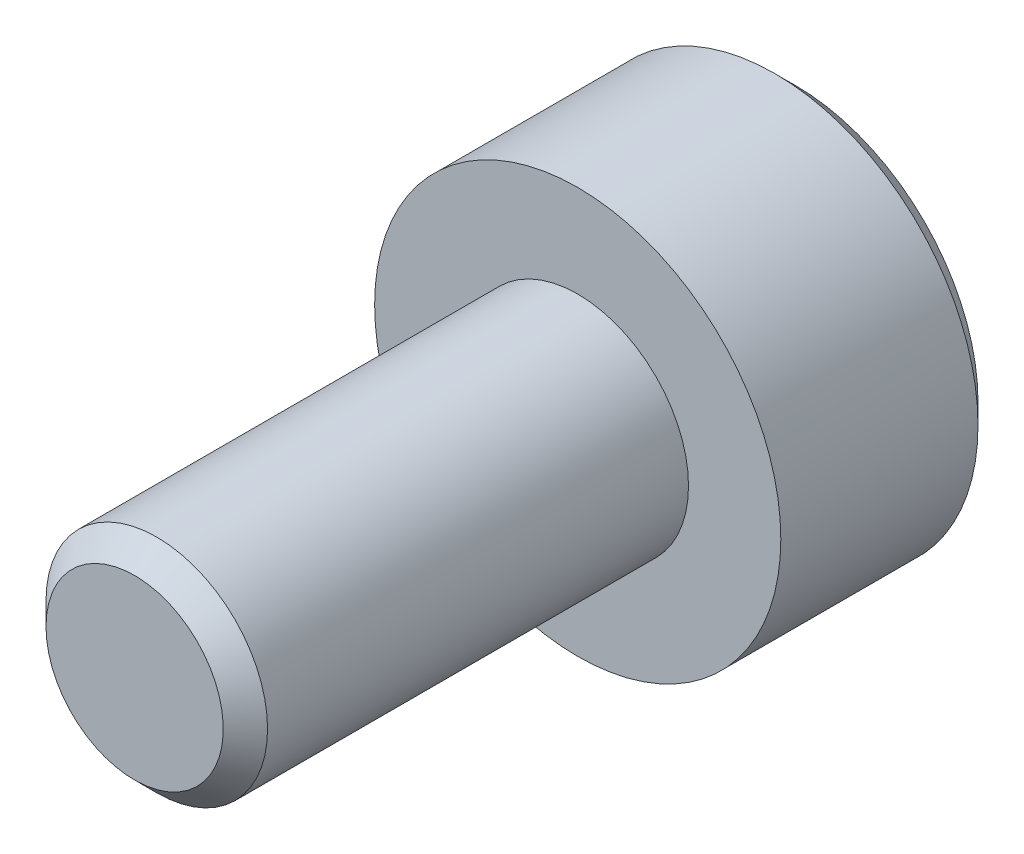
ISO-10303-21;
HEADER;
FILE_DESCRIPTION(('STEP AP214'),'2;1');
FILE_NAME('part.step','',(''),(''),'','','');
FILE_SCHEMA(('AUTOMOTIVE_DESIGN { 1 0 10303 214 1 1 1 1 }'));
ENDSEC;
DATA;
#1=APPLICATION_CONTEXT('core data for automotive mechanical design processes');
#2=APPLICATION_PROTOCOL_DEFINITION('international standard','automotive_design',2000,#1);
#3=PRODUCT_CONTEXT('',#1,'mechanical');
#4=PRODUCT('Part','Part','',(#3));
#5=PRODUCT_RELATED_PRODUCT_CATEGORY('part','',(#4));
#6=PRODUCT_DEFINITION_FORMATION('','',#4);
#7=PRODUCT_DEFINITION_CONTEXT('part definition',#1,'design');
#8=PRODUCT_DEFINITION('design','',#6,#7);
#9=PRODUCT_DEFINITION_SHAPE('','',#8);
#10=(LENGTH_UNIT() NAMED_UNIT(*) SI_UNIT(.MILLI.,.METRE.));
#11=(NAMED_UNIT(*) PLANE_ANGLE_UNIT() SI_UNIT($,.RADIAN.));
#12=(NAMED_UNIT(*) SI_UNIT($,.STERADIAN.) SOLID_ANGLE_UNIT());
#13=UNCERTAINTY_MEASURE_WITH_UNIT(LENGTH_MEASURE(1.E-05),#10,'distance_accuracy_value','');
#14=(GEOMETRIC_REPRESENTATION_CONTEXT(3) GLOBAL_UNCERTAINTY_ASSIGNED_CONTEXT((#13)) GLOBAL_UNIT_ASSIGNED_CONTEXT((#10,
#11,#12)) REPRESENTATION_CONTEXT('',''));
#15=CARTESIAN_POINT('',(0.,0.,0.));
#16=DIRECTION('',(0.,0.,1.));
#17=DIRECTION('',(1.,0.,0.));
#18=AXIS2_PLACEMENT_3D('',#15,#16,#17);
#19=CARTESIAN_POINT('',(0.,0.,-1.445));
#20=DIRECTION('',(0.,0.,1.));
#21=DIRECTION('',(1.,0.,0.));
#22=AXIS2_PLACEMENT_3D('',#19,#20,#21);
#23=PLANE('',#22);
#24=DIRECTION('',(-0.866025403784439,-0.5,0.));
#25=VECTOR('',#24,1.);
#26=CARTESIAN_POINT('',(-1.25,0.721687836487032,-1.445));
#27=LINE('',#26,#25);
#28=CARTESIAN_POINT('',(-1.25,0.721687836487032,-1.445));
#29=VERTEX_POINT('',#28);
#30=CARTESIAN_POINT('',(0.,1.44337567297406,-1.445));
#31=VERTEX_POINT('',#30);
#32=EDGE_CURVE('E68',#29,#31,#27,.F.);
#33=ORIENTED_EDGE('',*,*,#32,.T.);
#34=DIRECTION('',(-0.866025403784439,0.5,0.));
#35=VECTOR('',#34,1.);
#36=CARTESIAN_POINT('',(0.,1.44337567297406,-1.445));
#37=LINE('',#36,#35);
#38=CARTESIAN_POINT('',(1.25,0.721687836487031,-1.445));
#39=VERTEX_POINT('',#38);
#40=EDGE_CURVE('E98',#31,#39,#37,.F.);
#41=ORIENTED_EDGE('',*,*,#40,.T.);
#42=DIRECTION('',(0.,1.,0.));
#43=VECTOR('',#42,1.);
#44=CARTESIAN_POINT('',(1.25,0.721687836487032,-1.445));
#45=LINE('',#44,#43);
#46=CARTESIAN_POINT('',(1.25,-0.721687836487032,-1.445));
#47=VERTEX_POINT('',#46);
#48=EDGE_CURVE('E150',#39,#47,#45,.F.);
#49=ORIENTED_EDGE('',*,*,#48,.T.);
#50=DIRECTION('',(0.866025403784439,0.499999999999999,0.));
#51=VECTOR('',#50,1.);
#52=CARTESIAN_POINT('',(1.25,-0.721687836487032,-1.445));
#53=LINE('',#52,#51);
#54=CARTESIAN_POINT('',(0.,-1.44337567297406,-1.445));
#55=VERTEX_POINT('',#54);
#56=EDGE_CURVE('E143',#47,#55,#53,.F.);
#57=ORIENTED_EDGE('',*,*,#56,.T.);
#58=DIRECTION('',(0.866025403784438,-0.5,0.));
#59=VECTOR('',#58,1.);
#60=CARTESIAN_POINT('',(0.,-1.44337567297406,-1.445));
#61=LINE('',#60,#59);
#62=CARTESIAN_POINT('',(-1.25,-0.721687836487031,-1.445));
#63=VERTEX_POINT('',#62);
#64=EDGE_CURVE('E74',#55,#63,#61,.F.);
#65=ORIENTED_EDGE('',*,*,#64,.T.);
#66=DIRECTION('',(0.,1.,0.));
#67=VECTOR('',#66,1.);
#68=CARTESIAN_POINT('',(-1.25,-0.721687836487032,-1.445));
#69=LINE('',#68,#67);
#70=EDGE_CURVE('E71',#63,#29,#69,.T.);
#71=ORIENTED_EDGE('',*,*,#70,.T.);
#72=EDGE_LOOP('',(#33,#41,#49,#57,#65,#71));
#73=FACE_BOUND('',#72,.T.);
#74=ADVANCED_FACE('F16',(#73),#23,.F.);
#75=CARTESIAN_POINT('',(-1.25,-0.721687836487032,-2.945));
#76=DIRECTION('',(-1.,0.,0.));
#77=DIRECTION('',(0.,0.,1.));
#78=AXIS2_PLACEMENT_3D('',#75,#76,#77);
#79=PLANE('',#78);
#80=ORIENTED_EDGE('',*,*,#70,.F.);
#81=DIRECTION('',(0.,0.,1.));
#82=VECTOR('',#81,1.);
#83=CARTESIAN_POINT('',(-1.25,-0.721687836487029,-2.945));
#84=LINE('',#83,#82);
#85=CARTESIAN_POINT('',(-1.25,-0.721687836487031,-2.945));
#86=VERTEX_POINT('',#85);
#87=EDGE_CURVE('E136',#63,#86,#84,.F.);
#88=ORIENTED_EDGE('',*,*,#87,.T.);
#89=DIRECTION('',(0.,1.,0.));
#90=VECTOR('',#89,1.);
#91=CARTESIAN_POINT('',(-1.25,0.,-2.945));
#92=LINE('',#91,#90);
#93=CARTESIAN_POINT('',(-1.25,0.721687836487032,-2.945));
#94=VERTEX_POINT('',#93);
#95=EDGE_CURVE('E83',#86,#94,#92,.T.);
#96=ORIENTED_EDGE('',*,*,#95,.T.);
#97=DIRECTION('',(0.,0.,1.));
#98=VECTOR('',#97,1.);
#99=CARTESIAN_POINT('',(-1.25,0.721687836487032,-2.945));
#100=LINE('',#99,#98);
#101=EDGE_CURVE('E78',#94,#29,#100,.T.);
#102=ORIENTED_EDGE('',*,*,#101,.T.);
#103=EDGE_LOOP('',(#80,#88,#96,#102));
#104=FACE_BOUND('',#103,.T.);
#105=ADVANCED_FACE('F81',(#104),#79,.F.);
#106=CARTESIAN_POINT('',(-1.25,0.721687836487032,-2.945));
#107=DIRECTION('',(-0.5,0.866025403784439,0.));
#108=DIRECTION('',(-0.866025403784439,-0.5,0.));
#109=AXIS2_PLACEMENT_3D('',#106,#107,#108);
#110=PLANE('',#109);
#111=ORIENTED_EDGE('',*,*,#32,.F.);
#112=ORIENTED_EDGE('',*,*,#101,.F.);
#113=DIRECTION('',(0.86602540378444,0.499999999999998,0.));
#114=VECTOR('',#113,1.);
#115=CARTESIAN_POINT('',(-1.25,0.721687836487032,-2.945));
#116=LINE('',#115,#114);
#117=CARTESIAN_POINT('',(0.,1.44337567297406,-2.945));
#118=VERTEX_POINT('',#117);
#119=EDGE_CURVE('E131',#94,#118,#116,.T.);
#120=ORIENTED_EDGE('',*,*,#119,.T.);
#121=DIRECTION('',(0.,0.,1.));
#122=VECTOR('',#121,1.);
#123=CARTESIAN_POINT('',(0.,1.44337567297406,-2.945));
#124=LINE('',#123,#122);
#125=EDGE_CURVE('E90',#118,#31,#124,.T.);
#126=ORIENTED_EDGE('',*,*,#125,.T.);
#127=EDGE_LOOP('',(#111,#112,#120,#126));
#128=FACE_BOUND('',#127,.T.);
#129=ADVANCED_FACE('F88',(#128),#110,.F.);
#130=CARTESIAN_POINT('',(0.,1.44337567297406,-2.945));
#131=DIRECTION('',(0.5,0.866025403784439,0.));
#132=DIRECTION('',(-0.866025403784439,0.5,0.));
#133=AXIS2_PLACEMENT_3D('',#130,#131,#132);
#134=PLANE('',#133);
#135=ORIENTED_EDGE('',*,*,#40,.F.);
#136=ORIENTED_EDGE('',*,*,#125,.F.);
#137=DIRECTION('',(0.86602540378444,-0.499999999999998,0.));
#138=VECTOR('',#137,1.);
#139=CARTESIAN_POINT('',(0.,1.44337567297406,-2.945));
#140=LINE('',#139,#138);
#141=CARTESIAN_POINT('',(1.25,0.721687836487031,-2.945));
#142=VERTEX_POINT('',#141);
#143=EDGE_CURVE('E128',#118,#142,#140,.T.);
#144=ORIENTED_EDGE('',*,*,#143,.T.);
#145=DIRECTION('',(0.,0.,-1.));
#146=VECTOR('',#145,1.);
#147=CARTESIAN_POINT('',(1.25,0.721687836487032,-2.945));
#148=LINE('',#147,#146);
#149=EDGE_CURVE('E153',#142,#39,#148,.F.);
#150=ORIENTED_EDGE('',*,*,#149,.T.);
#151=EDGE_LOOP('',(#135,#136,#144,#150));
#152=FACE_BOUND('',#151,.T.);
#153=ADVANCED_FACE('F160',(#152),#134,.F.);
#154=CARTESIAN_POINT('',(1.25,0.721687836487032,-2.945));
#155=DIRECTION('',(1.,0.,0.));
#156=DIRECTION('',(0.,0.,-1.));
#157=AXIS2_PLACEMENT_3D('',#154,#155,#156);
#158=PLANE('',#157);
#159=ORIENTED_EDGE('',*,*,#48,.F.);
#160=ORIENTED_EDGE('',*,*,#149,.F.);
#161=DIRECTION('',(0.,1.,0.));
#162=VECTOR('',#161,1.);
#163=CARTESIAN_POINT('',(1.25,0.,-2.945));
#164=LINE('',#163,#162);
#165=CARTESIAN_POINT('',(1.25,-0.721687836487032,-2.945));
#166=VERTEX_POINT('',#165);
#167=EDGE_CURVE('E125',#142,#166,#164,.F.);
#168=ORIENTED_EDGE('',*,*,#167,.T.);
#169=DIRECTION('',(0.,0.,1.));
#170=VECTOR('',#169,1.);
#171=CARTESIAN_POINT('',(1.25,-0.721687836487032,-2.945));
#172=LINE('',#171,#170);
#173=EDGE_CURVE('E146',#166,#47,#172,.T.);
#174=ORIENTED_EDGE('',*,*,#173,.T.);
#175=EDGE_LOOP('',(#159,#160,#168,#174));
#176=FACE_BOUND('',#175,.T.);
#177=ADVANCED_FACE('F164',(#176),#158,.F.);
#178=CARTESIAN_POINT('',(1.25,-0.721687836487032,-2.945));
#179=DIRECTION('',(0.499999999999999,-0.866025403784439,0.));
#180=DIRECTION('',(0.866025403784439,0.499999999999999,0.));
#181=AXIS2_PLACEMENT_3D('',#178,#179,#180);
#182=PLANE('',#181);
#183=ORIENTED_EDGE('',*,*,#56,.F.);
#184=ORIENTED_EDGE('',*,*,#173,.F.);
#185=DIRECTION('',(-0.86602540378444,-0.499999999999998,0.));
#186=VECTOR('',#185,1.);
#187=CARTESIAN_POINT('',(1.25,-0.721687836487032,-2.945));
#188=LINE('',#187,#186);
#189=CARTESIAN_POINT('',(0.,-1.44337567297406,-2.945));
#190=VERTEX_POINT('',#189);
#191=EDGE_CURVE('E35',#166,#190,#188,.T.);
#192=ORIENTED_EDGE('',*,*,#191,.T.);
#193=DIRECTION('',(0.,0.,1.));
#194=VECTOR('',#193,1.);
#195=CARTESIAN_POINT('',(0.,-1.44337567297406,-2.945));
#196=LINE('',#195,#194);
#197=EDGE_CURVE('E141',#190,#55,#196,.T.);
#198=ORIENTED_EDGE('',*,*,#197,.T.);
#199=EDGE_LOOP('',(#183,#184,#192,#198));
#200=FACE_BOUND('',#199,.T.);
#201=ADVANCED_FACE('F166',(#200),#182,.F.);
#202=CARTESIAN_POINT('',(0.,-1.44337567297406,-2.945));
#203=DIRECTION('',(-0.5,-0.866025403784438,0.));
#204=DIRECTION('',(0.866025403784438,-0.5,0.));
#205=AXIS2_PLACEMENT_3D('',#202,#203,#204);
#206=PLANE('',#205);
#207=ORIENTED_EDGE('',*,*,#64,.F.);
#208=ORIENTED_EDGE('',*,*,#197,.F.);
#209=DIRECTION('',(-0.86602540378444,0.499999999999998,0.));
#210=VECTOR('',#209,1.);
#211=CARTESIAN_POINT('',(0.,-1.44337567297406,-2.945));
#212=LINE('',#211,#210);
#213=EDGE_CURVE('E118',#190,#86,#212,.T.);
#214=ORIENTED_EDGE('',*,*,#213,.T.);
#215=ORIENTED_EDGE('',*,*,#87,.F.);
#216=EDGE_LOOP('',(#207,#208,#214,#215));
#217=FACE_BOUND('',#216,.T.);
#218=ADVANCED_FACE('F169',(#217),#206,.F.);
#219=CARTESIAN_POINT('',(0.,0.,-2.945));
#220=DIRECTION('',(0.,0.,1.));
#221=DIRECTION('',(1.,0.,0.));
#222=AXIS2_PLACEMENT_3D('',#219,#220,#221);
#223=PLANE('',#222);
#224=ORIENTED_EDGE('',*,*,#191,.F.);
#225=ORIENTED_EDGE('',*,*,#167,.F.);
#226=ORIENTED_EDGE('',*,*,#143,.F.);
#227=ORIENTED_EDGE('',*,*,#119,.F.);
#228=ORIENTED_EDGE('',*,*,#95,.F.);
#229=ORIENTED_EDGE('',*,*,#213,.F.);
#230=EDGE_LOOP('',(#224,#225,#226,#227,#228,#229));
#231=FACE_BOUND('',#230,.T.);
#232=CARTESIAN_POINT('',(0.,0.,-2.94499999995423));
#233=DIRECTION('',(0.,0.,1.));
#234=DIRECTION('',(1.,0.,0.));
#235=AXIS2_PLACEMENT_3D('',#232,#233,#234);
#236=CIRCLE('',#235,2.47500000006085);
#237=CARTESIAN_POINT('',(2.47500000006085,0.,-2.94499999995423));
#238=VERTEX_POINT('',#237);
#239=EDGE_CURVE('E19',#238,#238,#236,.T.);
#240=ORIENTED_EDGE('',*,*,#239,.F.);
#241=EDGE_LOOP('',(#240));
#242=FACE_BOUND('',#241,.T.);
#243=ADVANCED_FACE('F171',(#231,#242),#223,.F.);
#244=CARTESIAN_POINT('',(0.,0.,-2.66999999996642));
#245=DIRECTION('',(0.,0.,1.));
#246=DIRECTION('',(1.,0.,0.));
#247=AXIS2_PLACEMENT_3D('',#244,#245,#246);
#248=CONICAL_SURFACE('',#247,2.75000000004866,0.785398163397448);
#249=ORIENTED_EDGE('',*,*,#239,.T.);
#250=EDGE_LOOP('',(#249));
#251=FACE_BOUND('',#250,.T.);
#252=CARTESIAN_POINT('',(0.,0.,-2.67));
#253=DIRECTION('',(0.,0.,1.));
#254=DIRECTION('',(1.,0.,0.));
#255=AXIS2_PLACEMENT_3D('',#252,#253,#254);
#256=CIRCLE('',#255,2.75);
#257=CARTESIAN_POINT('',(2.75,0.,-2.67));
#258=VERTEX_POINT('',#257);
#259=EDGE_CURVE('E108',#258,#258,#256,.T.);
#260=ORIENTED_EDGE('',*,*,#259,.F.);
#261=EDGE_LOOP('',(#260));
#262=FACE_BOUND('',#261,.T.);
#263=ADVANCED_FACE('F174',(#251,#262),#248,.T.);
#264=CARTESIAN_POINT('',(0.,0.,6.));
#265=DIRECTION('',(0.,0.,1.));
#266=DIRECTION('',(1.,0.,0.));
#267=AXIS2_PLACEMENT_3D('',#264,#265,#266);
#268=PLANE('',#267);
#269=CARTESIAN_POINT('',(0.,0.,6.00000000002865));
#270=DIRECTION('',(0.,0.,-1.));
#271=DIRECTION('',(-1.,0.,0.));
#272=AXIS2_PLACEMENT_3D('',#269,#270,#271);
#273=CIRCLE('',#272,1.19999999998299);
#274=CARTESIAN_POINT('',(-1.19999999998299,0.,6.00000000002865));
#275=VERTEX_POINT('',#274);
#276=EDGE_CURVE('E105',#275,#275,#273,.T.);
#277=ORIENTED_EDGE('',*,*,#276,.F.);
#278=EDGE_LOOP('',(#277));
#279=FACE_BOUND('',#278,.T.);
#280=ADVANCED_FACE('F180',(#279),#268,.T.);
#281=CARTESIAN_POINT('',(0.,0.,-2.945));
#282=DIRECTION('',(0.,0.,1.));
#283=DIRECTION('',(1.,0.,0.));
#284=AXIS2_PLACEMENT_3D('',#281,#282,#283);
#285=CYLINDRICAL_SURFACE('',#284,2.75);
#286=ORIENTED_EDGE('',*,*,#259,.T.);
#287=EDGE_LOOP('',(#286));
#288=FACE_BOUND('',#287,.T.);
#289=CARTESIAN_POINT('',(0.,0.,0.));
#290=DIRECTION('',(0.,0.,1.));
#291=DIRECTION('',(1.,0.,0.));
#292=AXIS2_PLACEMENT_3D('',#289,#290,#291);
#293=CIRCLE('',#292,2.75);
#294=CARTESIAN_POINT('',(2.75,0.,0.));
#295=VERTEX_POINT('',#294);
#296=EDGE_CURVE('E102',#295,#295,#293,.T.);
#297=ORIENTED_EDGE('',*,*,#296,.F.);
#298=EDGE_LOOP('',(#297));
#299=FACE_BOUND('',#298,.T.);
#300=ADVANCED_FACE('F185',(#288,#299),#285,.T.);
#301=CARTESIAN_POINT('',(0.,0.,5.70000000010396));
#302=DIRECTION('',(0.,0.,-1.));
#303=DIRECTION('',(-1.,0.,0.));
#304=AXIS2_PLACEMENT_3D('',#301,#302,#303);
#305=CONICAL_SURFACE('',#304,1.49999999990769,0.785398163397448);
#306=CARTESIAN_POINT('',(0.,0.,5.7));
#307=DIRECTION('',(0.,0.,1.));
#308=DIRECTION('',(1.,0.,0.));
#309=AXIS2_PLACEMENT_3D('',#306,#307,#308);
#310=CIRCLE('',#309,1.5);
#311=CARTESIAN_POINT('',(1.5,0.,5.7));
#312=VERTEX_POINT('',#311);
#313=EDGE_CURVE('E26',#312,#312,#310,.F.);
#314=ORIENTED_EDGE('',*,*,#313,.F.);
#315=EDGE_LOOP('',(#314));
#316=FACE_BOUND('',#315,.T.);
#317=ORIENTED_EDGE('',*,*,#276,.T.);
#318=EDGE_LOOP('',(#317));
#319=FACE_BOUND('',#318,.T.);
#320=ADVANCED_FACE('F195',(#316,#319),#305,.T.);
#321=CARTESIAN_POINT('',(0.,0.,0.));
#322=DIRECTION('',(0.,0.,1.));
#323=DIRECTION('',(1.,0.,0.));
#324=AXIS2_PLACEMENT_3D('',#321,#322,#323);
#325=PLANE('',#324);
#326=CARTESIAN_POINT('',(0.,0.,0.));
#327=DIRECTION('',(0.,0.,1.));
#328=DIRECTION('',(1.,0.,0.));
#329=AXIS2_PLACEMENT_3D('',#326,#327,#328);
#330=CIRCLE('',#329,1.5);
#331=CARTESIAN_POINT('',(1.5,0.,0.));
#332=VERTEX_POINT('',#331);
#333=EDGE_CURVE('E11',#332,#332,#330,.T.);
#334=ORIENTED_EDGE('',*,*,#333,.F.);
#335=EDGE_LOOP('',(#334));
#336=FACE_BOUND('',#335,.T.);
#337=ORIENTED_EDGE('',*,*,#296,.T.);
#338=EDGE_LOOP('',(#337));
#339=FACE_BOUND('',#338,.T.);
#340=ADVANCED_FACE('F190',(#336,#339),#325,.T.);
#341=CARTESIAN_POINT('',(0.,0.,0.));
#342=DIRECTION('',(0.,0.,1.));
#343=DIRECTION('',(1.,0.,0.));
#344=AXIS2_PLACEMENT_3D('',#341,#342,#343);
#345=CYLINDRICAL_SURFACE('',#344,1.5);
#346=ORIENTED_EDGE('',*,*,#333,.T.);
#347=EDGE_LOOP('',(#346));
#348=FACE_BOUND('',#347,.T.);
#349=ORIENTED_EDGE('',*,*,#313,.T.);
#350=EDGE_LOOP('',(#349));
#351=FACE_BOUND('',#350,.T.);
#352=ADVANCED_FACE('F188',(#348,#351),#345,.T.);
#353=CLOSED_SHELL('',(#74,#105,#129,#153,#177,#201,#218,#243,#263,#280,#300,#320,#340,#352));
#354=MANIFOLD_SOLID_BREP('B1',#353);
#355=ADVANCED_BREP_SHAPE_REPRESENTATION('',(#18,#354),#14);
#356=SHAPE_DEFINITION_REPRESENTATION(#9,#355);
ENDSEC;
END-ISO-10303-21;
